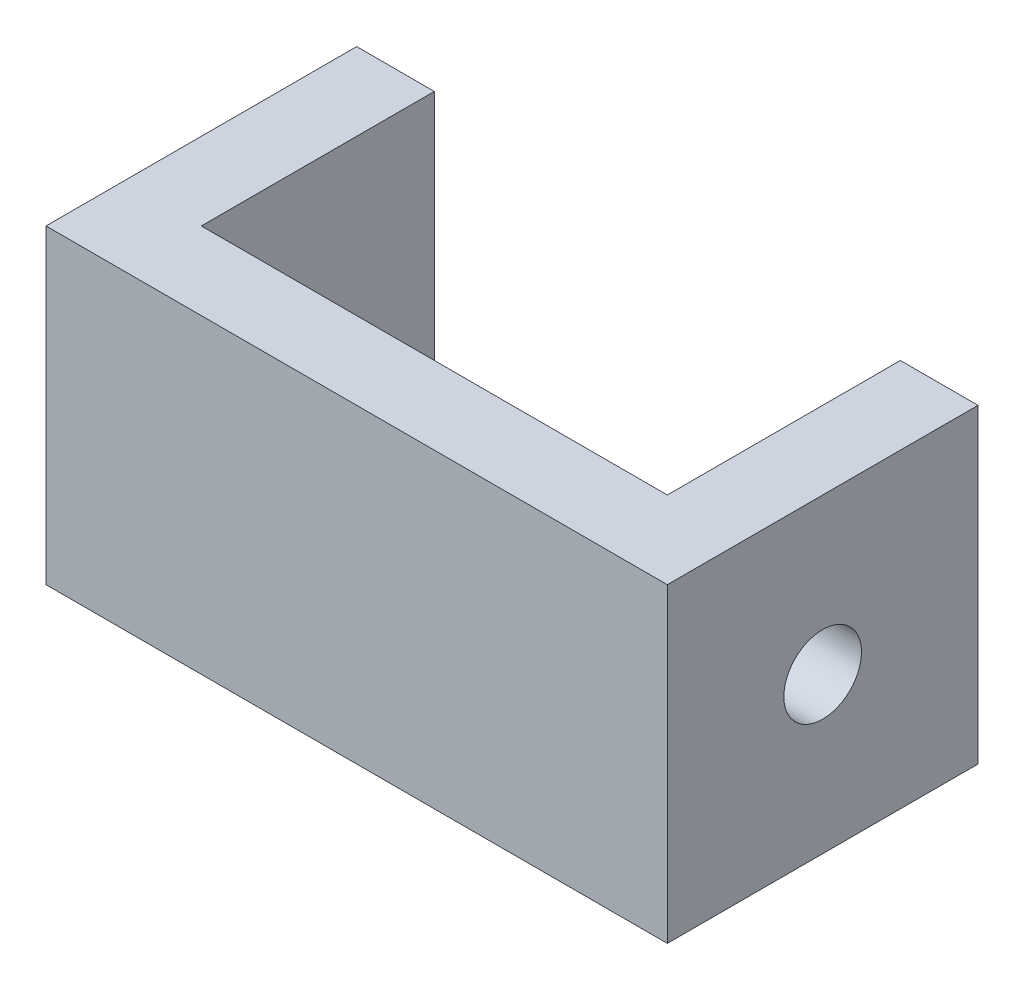
ISO-10303-21;
HEADER;
FILE_DESCRIPTION(('STEP AP214'),'2;1');
FILE_NAME('part.step','',(''),(''),'','','');
FILE_SCHEMA(('AUTOMOTIVE_DESIGN { 1 0 10303 214 1 1 1 1 }'));
ENDSEC;
DATA;
#1=APPLICATION_CONTEXT('core data for automotive mechanical design processes');
#2=APPLICATION_PROTOCOL_DEFINITION('international standard','automotive_design',2000,#1);
#3=PRODUCT_CONTEXT('',#1,'mechanical');
#4=PRODUCT('Part','Part','',(#3));
#5=PRODUCT_RELATED_PRODUCT_CATEGORY('part','',(#4));
#6=PRODUCT_DEFINITION_FORMATION('','',#4);
#7=PRODUCT_DEFINITION_CONTEXT('part definition',#1,'design');
#8=PRODUCT_DEFINITION('design','',#6,#7);
#9=PRODUCT_DEFINITION_SHAPE('','',#8);
#10=(LENGTH_UNIT() NAMED_UNIT(*) SI_UNIT(.MILLI.,.METRE.));
#11=(NAMED_UNIT(*) PLANE_ANGLE_UNIT() SI_UNIT($,.RADIAN.));
#12=(NAMED_UNIT(*) SI_UNIT($,.STERADIAN.) SOLID_ANGLE_UNIT());
#13=UNCERTAINTY_MEASURE_WITH_UNIT(LENGTH_MEASURE(1.E-05),#10,'distance_accuracy_value','');
#14=(GEOMETRIC_REPRESENTATION_CONTEXT(3) GLOBAL_UNCERTAINTY_ASSIGNED_CONTEXT((#13)) GLOBAL_UNIT_ASSIGNED_CONTEXT((#10,
#11,#12)) REPRESENTATION_CONTEXT('',''));
#15=CARTESIAN_POINT('',(0.,0.,0.));
#16=DIRECTION('',(0.,0.,1.));
#17=DIRECTION('',(1.,0.,0.));
#18=AXIS2_PLACEMENT_3D('',#15,#16,#17);
#19=CARTESIAN_POINT('',(24.,10.,0.));
#20=DIRECTION('',(-1.,0.,0.));
#21=DIRECTION('',(0.,0.,1.));
#22=AXIS2_PLACEMENT_3D('',#19,#20,#21);
#23=CYLINDRICAL_SURFACE('',#22,2.5);
#24=CARTESIAN_POINT('',(15.,10.,0.));
#25=DIRECTION('',(-1.,0.,0.));
#26=DIRECTION('',(0.,0.,1.));
#27=AXIS2_PLACEMENT_3D('',#24,#25,#26);
#28=CIRCLE('',#27,2.5);
#29=CARTESIAN_POINT('',(15.,10.,2.5));
#30=VERTEX_POINT('',#29);
#31=EDGE_CURVE('E39',#30,#30,#28,.T.);
#32=CARTESIAN_POINT('',(20.,10.,0.));
#33=DIRECTION('',(-1.,0.,0.));
#34=DIRECTION('',(0.,0.,1.));
#35=AXIS2_PLACEMENT_3D('',#32,#33,#34);
#36=CIRCLE('',#35,2.5);
#37=CARTESIAN_POINT('',(20.,10.,2.5));
#38=VERTEX_POINT('',#37);
#39=EDGE_CURVE('E148',#38,#38,#36,.T.);
#40=CARTESIAN_POINT('',(15.,10.,2.5));
#41=CARTESIAN_POINT('',(15.0520833333333,10.,2.5));
#42=CARTESIAN_POINT('',(15.1041666666667,10.,2.5));
#43=CARTESIAN_POINT('',(15.2083333333333,10.,2.5));
#44=CARTESIAN_POINT('',(15.2604166666667,10.,2.5));
#45=CARTESIAN_POINT('',(15.3645833333333,10.,2.5));
#46=CARTESIAN_POINT('',(15.4166666666667,10.,2.5));
#47=CARTESIAN_POINT('',(15.5208333333333,10.,2.5));
#48=CARTESIAN_POINT('',(15.5729166666667,10.,2.5));
#49=CARTESIAN_POINT('',(15.6770833333333,10.,2.5));
#50=CARTESIAN_POINT('',(15.7291666666667,10.,2.5));
#51=CARTESIAN_POINT('',(15.8333333333333,10.,2.5));
#52=CARTESIAN_POINT('',(15.8854166666667,10.,2.5));
#53=CARTESIAN_POINT('',(15.9895833333333,10.,2.5));
#54=CARTESIAN_POINT('',(16.0416666666667,10.,2.5));
#55=CARTESIAN_POINT('',(16.1458333333333,10.,2.5));
#56=CARTESIAN_POINT('',(16.1979166666667,10.,2.5));
#57=CARTESIAN_POINT('',(16.3020833333333,10.,2.5));
#58=CARTESIAN_POINT('',(16.3541666666667,10.,2.5));
#59=CARTESIAN_POINT('',(16.4583333333333,10.,2.5));
#60=CARTESIAN_POINT('',(16.5104166666667,10.,2.5));
#61=CARTESIAN_POINT('',(16.6145833333333,10.,2.5));
#62=CARTESIAN_POINT('',(16.6666666666667,10.,2.5));
#63=CARTESIAN_POINT('',(16.7708333333333,10.,2.5));
#64=CARTESIAN_POINT('',(16.8229166666667,10.,2.5));
#65=CARTESIAN_POINT('',(16.9270833333333,10.,2.5));
#66=CARTESIAN_POINT('',(16.9791666666667,10.,2.5));
#67=CARTESIAN_POINT('',(17.0833333333333,10.,2.5));
#68=CARTESIAN_POINT('',(17.1354166666667,10.,2.5));
#69=CARTESIAN_POINT('',(17.2395833333333,10.,2.5));
#70=CARTESIAN_POINT('',(17.2916666666667,10.,2.5));
#71=CARTESIAN_POINT('',(17.3958333333333,10.,2.5));
#72=CARTESIAN_POINT('',(17.4479166666667,10.,2.5));
#73=CARTESIAN_POINT('',(17.5520833333333,10.,2.5));
#74=CARTESIAN_POINT('',(17.6041666666667,10.,2.5));
#75=CARTESIAN_POINT('',(17.7083333333333,10.,2.5));
#76=CARTESIAN_POINT('',(17.7604166666667,10.,2.5));
#77=CARTESIAN_POINT('',(17.8645833333333,10.,2.5));
#78=CARTESIAN_POINT('',(17.9166666666667,10.,2.5));
#79=CARTESIAN_POINT('',(18.0208333333333,10.,2.5));
#80=CARTESIAN_POINT('',(18.0729166666667,10.,2.5));
#81=CARTESIAN_POINT('',(18.1770833333333,10.,2.5));
#82=CARTESIAN_POINT('',(18.2291666666667,10.,2.5));
#83=CARTESIAN_POINT('',(18.3333333333333,10.,2.5));
#84=CARTESIAN_POINT('',(18.3854166666667,10.,2.5));
#85=CARTESIAN_POINT('',(18.4895833333333,10.,2.5));
#86=CARTESIAN_POINT('',(18.5416666666667,10.,2.5));
#87=CARTESIAN_POINT('',(18.6458333333333,10.,2.5));
#88=CARTESIAN_POINT('',(18.6979166666667,10.,2.5));
#89=CARTESIAN_POINT('',(18.8020833333333,10.,2.5));
#90=CARTESIAN_POINT('',(18.8541666666667,10.,2.5));
#91=CARTESIAN_POINT('',(18.9583333333333,10.,2.5));
#92=CARTESIAN_POINT('',(19.0104166666667,10.,2.5));
#93=CARTESIAN_POINT('',(19.1145833333333,10.,2.5));
#94=CARTESIAN_POINT('',(19.1666666666667,10.,2.5));
#95=CARTESIAN_POINT('',(19.2708333333333,10.,2.5));
#96=CARTESIAN_POINT('',(19.3229166666667,10.,2.5));
#97=CARTESIAN_POINT('',(19.4270833333333,10.,2.5));
#98=CARTESIAN_POINT('',(19.4791666666667,10.,2.5));
#99=CARTESIAN_POINT('',(19.5833333333333,10.,2.5));
#100=CARTESIAN_POINT('',(19.6354166666667,10.,2.5));
#101=CARTESIAN_POINT('',(19.7395833333333,10.,2.5));
#102=CARTESIAN_POINT('',(19.7916666666667,10.,2.5));
#103=CARTESIAN_POINT('',(19.8958333333333,10.,2.5));
#104=CARTESIAN_POINT('',(19.9479166666667,10.,2.5));
#105=CARTESIAN_POINT('',(20.,10.,2.5));
#106=B_SPLINE_CURVE_WITH_KNOTS('',3,(#40,#41,#42,#43,#44,#45,#46,#47,#48,#49,#50,#51,#52,#53,
#54,#55,#56,#57,#58,#59,#60,#61,#62,#63,#64,#65,#66,#67,#68,#69,#70,#71,#72,#73,#74,#75,#76,#77,
#78,#79,#80,#81,#82,#83,#84,#85,#86,#87,#88,#89,#90,#91,#92,#93,#94,#95,#96,#97,#98,#99,#100,
#101,#102,#103,#104,#105),.UNSPECIFIED.,.F.,.F.,(4,2,2,2,2,2,2,2,2,2,2,2,2,2,2,2,2,2,2,2,2,2,2,
2,2,2,2,2,2,2,2,2,4),(0.,0.15625,0.3125,0.46875,0.625000000000001,0.781250000000001,
0.937500000000001,1.09375,1.25,1.40625,1.5625,1.71875,1.875,2.03125,2.1875,2.34375,2.5,2.65625,
2.8125,2.96875,3.125,3.28125,3.4375,3.59375,3.75,3.90625,4.0625,4.21875,4.375,4.53125,4.6875,
4.84375,5.),.UNSPECIFIED.);
#107=EDGE_CURVE('BSEAM35',#30,#38,#106,.T.);
#108=ORIENTED_EDGE('',*,*,#31,.T.);
#109=ORIENTED_EDGE('',*,*,#39,.F.);
#110=ORIENTED_EDGE('',*,*,#107,.T.);
#111=ORIENTED_EDGE('',*,*,#107,.F.);
#112=EDGE_LOOP('',(#108,#110,#109,#111));
#113=FACE_BOUND('',#112,.T.);
#114=ADVANCED_FACE('F35',(#113),#23,.F.);
#115=CARTESIAN_POINT('',(15.,20.,0.));
#116=DIRECTION('',(-1.,0.,0.));
#117=DIRECTION('',(0.,0.,1.));
#118=AXIS2_PLACEMENT_3D('',#115,#116,#117);
#119=PLANE('',#118);
#120=ORIENTED_EDGE('',*,*,#31,.F.);
#121=EDGE_LOOP('',(#120));
#122=FACE_BOUND('',#121,.T.);
#123=DIRECTION('',(0.,0.,-1.));
#124=VECTOR('',#123,1.);
#125=CARTESIAN_POINT('',(15.,0.,0.));
#126=LINE('',#125,#124);
#127=CARTESIAN_POINT('',(15.,0.,5.00000000000001));
#128=VERTEX_POINT('',#127);
#129=CARTESIAN_POINT('',(15.,0.,-9.99999999999999));
#130=VERTEX_POINT('',#129);
#131=EDGE_CURVE('E141',#128,#130,#126,.T.);
#132=ORIENTED_EDGE('',*,*,#131,.F.);
#133=DIRECTION('',(0.,-1.,0.));
#134=VECTOR('',#133,1.);
#135=CARTESIAN_POINT('',(15.,20.,5.00000000000001));
#136=LINE('',#135,#134);
#137=CARTESIAN_POINT('',(15.,20.,5.00000000000001));
#138=VERTEX_POINT('',#137);
#139=EDGE_CURVE('E53',#138,#128,#136,.T.);
#140=ORIENTED_EDGE('',*,*,#139,.F.);
#141=DIRECTION('',(0.,0.,-1.));
#142=VECTOR('',#141,1.);
#143=CARTESIAN_POINT('',(15.,20.,0.));
#144=LINE('',#143,#142);
#145=CARTESIAN_POINT('',(15.,20.,-9.99999999999999));
#146=VERTEX_POINT('',#145);
#147=EDGE_CURVE('E127',#138,#146,#144,.T.);
#148=ORIENTED_EDGE('',*,*,#147,.T.);
#149=DIRECTION('',(0.,-1.,0.));
#150=VECTOR('',#149,1.);
#151=CARTESIAN_POINT('',(15.,20.,-9.99999999999999));
#152=LINE('',#151,#150);
#153=EDGE_CURVE('E78',#146,#130,#152,.T.);
#154=ORIENTED_EDGE('',*,*,#153,.T.);
#155=EDGE_LOOP('',(#132,#140,#148,#154));
#156=FACE_BOUND('',#155,.T.);
#157=ADVANCED_FACE('F160',(#122,#156),#119,.T.);
#158=CARTESIAN_POINT('',(0.,20.,-9.99999999999999));
#159=DIRECTION('',(0.,0.,-1.));
#160=DIRECTION('',(-1.,0.,0.));
#161=AXIS2_PLACEMENT_3D('',#158,#159,#160);
#162=PLANE('',#161);
#163=DIRECTION('',(1.,0.,0.));
#164=VECTOR('',#163,1.);
#165=CARTESIAN_POINT('',(0.,0.,-9.99999999999999));
#166=LINE('',#165,#164);
#167=CARTESIAN_POINT('',(20.,0.,-9.99999999999999));
#168=VERTEX_POINT('',#167);
#169=EDGE_CURVE('E165',#130,#168,#166,.T.);
#170=ORIENTED_EDGE('',*,*,#169,.F.);
#171=ORIENTED_EDGE('',*,*,#153,.F.);
#172=DIRECTION('',(1.,0.,0.));
#173=VECTOR('',#172,1.);
#174=CARTESIAN_POINT('',(0.,20.,-9.99999999999999));
#175=LINE('',#174,#173);
#176=CARTESIAN_POINT('',(20.,20.,-9.99999999999999));
#177=VERTEX_POINT('',#176);
#178=EDGE_CURVE('E109',#146,#177,#175,.T.);
#179=ORIENTED_EDGE('',*,*,#178,.T.);
#180=DIRECTION('',(0.,-1.,0.));
#181=VECTOR('',#180,1.);
#182=CARTESIAN_POINT('',(20.,20.,-9.99999999999999));
#183=LINE('',#182,#181);
#184=EDGE_CURVE('E118',#177,#168,#183,.T.);
#185=ORIENTED_EDGE('',*,*,#184,.T.);
#186=EDGE_LOOP('',(#170,#171,#179,#185));
#187=FACE_BOUND('',#186,.T.);
#188=ADVANCED_FACE('F126',(#187),#162,.T.);
#189=CARTESIAN_POINT('',(20.,20.,0.));
#190=DIRECTION('',(-1.,0.,0.));
#191=DIRECTION('',(0.,0.,1.));
#192=AXIS2_PLACEMENT_3D('',#189,#190,#191);
#193=PLANE('',#192);
#194=ORIENTED_EDGE('',*,*,#39,.T.);
#195=EDGE_LOOP('',(#194));
#196=FACE_BOUND('',#195,.T.);
#197=DIRECTION('',(0.,0.,-1.));
#198=VECTOR('',#197,1.);
#199=CARTESIAN_POINT('',(20.,0.,0.));
#200=LINE('',#199,#198);
#201=CARTESIAN_POINT('',(20.,0.,10.));
#202=VERTEX_POINT('',#201);
#203=EDGE_CURVE('E121',#202,#168,#200,.T.);
#204=ORIENTED_EDGE('',*,*,#203,.T.);
#205=ORIENTED_EDGE('',*,*,#184,.F.);
#206=DIRECTION('',(0.,0.,-1.));
#207=VECTOR('',#206,1.);
#208=CARTESIAN_POINT('',(20.,20.,0.));
#209=LINE('',#208,#207);
#210=CARTESIAN_POINT('',(20.,20.,10.));
#211=VERTEX_POINT('',#210);
#212=EDGE_CURVE('E103',#211,#177,#209,.T.);
#213=ORIENTED_EDGE('',*,*,#212,.F.);
#214=DIRECTION('',(0.,-1.,0.));
#215=VECTOR('',#214,1.);
#216=CARTESIAN_POINT('',(20.,20.,10.));
#217=LINE('',#216,#215);
#218=EDGE_CURVE('E124',#211,#202,#217,.T.);
#219=ORIENTED_EDGE('',*,*,#218,.T.);
#220=EDGE_LOOP('',(#204,#205,#213,#219));
#221=FACE_BOUND('',#220,.T.);
#222=ADVANCED_FACE('F119',(#196,#221),#193,.F.);
#223=CARTESIAN_POINT('',(-15.,20.,0.));
#224=DIRECTION('',(-1.,0.,0.));
#225=DIRECTION('',(0.,0.,1.));
#226=AXIS2_PLACEMENT_3D('',#223,#224,#225);
#227=PLANE('',#226);
#228=CARTESIAN_POINT('',(-15.,10.,0.));
#229=DIRECTION('',(-1.,0.,0.));
#230=DIRECTION('',(0.,0.,1.));
#231=AXIS2_PLACEMENT_3D('',#228,#229,#230);
#232=CIRCLE('',#231,2.5);
#233=CARTESIAN_POINT('',(-15.,10.,2.5));
#234=VERTEX_POINT('',#233);
#235=EDGE_CURVE('E144',#234,#234,#232,.T.);
#236=ORIENTED_EDGE('',*,*,#235,.T.);
#237=EDGE_LOOP('',(#236));
#238=FACE_BOUND('',#237,.T.);
#239=DIRECTION('',(0.,0.,-1.));
#240=VECTOR('',#239,1.);
#241=CARTESIAN_POINT('',(-15.,0.,0.));
#242=LINE('',#241,#240);
#243=CARTESIAN_POINT('',(-15.,0.,5.00000000000001));
#244=VERTEX_POINT('',#243);
#245=CARTESIAN_POINT('',(-15.,0.,-9.99999999999999));
#246=VERTEX_POINT('',#245);
#247=EDGE_CURVE('E186',#244,#246,#242,.T.);
#248=ORIENTED_EDGE('',*,*,#247,.T.);
#249=DIRECTION('',(0.,-1.,0.));
#250=VECTOR('',#249,1.);
#251=CARTESIAN_POINT('',(-15.,20.,-9.99999999999999));
#252=LINE('',#251,#250);
#253=CARTESIAN_POINT('',(-15.,20.,-9.99999999999999));
#254=VERTEX_POINT('',#253);
#255=EDGE_CURVE('E45',#254,#246,#252,.T.);
#256=ORIENTED_EDGE('',*,*,#255,.F.);
#257=DIRECTION('',(0.,0.,-1.));
#258=VECTOR('',#257,1.);
#259=CARTESIAN_POINT('',(-15.,20.,0.));
#260=LINE('',#259,#258);
#261=CARTESIAN_POINT('',(-15.,20.,5.00000000000001));
#262=VERTEX_POINT('',#261);
#263=EDGE_CURVE('E135',#262,#254,#260,.T.);
#264=ORIENTED_EDGE('',*,*,#263,.F.);
#265=DIRECTION('',(0.,-1.,0.));
#266=VECTOR('',#265,1.);
#267=CARTESIAN_POINT('',(-15.,20.,5.00000000000001));
#268=LINE('',#267,#266);
#269=EDGE_CURVE('E11',#262,#244,#268,.T.);
#270=ORIENTED_EDGE('',*,*,#269,.T.);
#271=EDGE_LOOP('',(#248,#256,#264,#270));
#272=FACE_BOUND('',#271,.T.);
#273=ADVANCED_FACE('F187',(#238,#272),#227,.F.);
#274=CARTESIAN_POINT('',(0.,20.,5.00000000000001));
#275=DIRECTION('',(0.,0.,-1.));
#276=DIRECTION('',(-1.,0.,0.));
#277=AXIS2_PLACEMENT_3D('',#274,#275,#276);
#278=PLANE('',#277);
#279=DIRECTION('',(1.,0.,0.));
#280=VECTOR('',#279,1.);
#281=CARTESIAN_POINT('',(0.,0.,5.00000000000001));
#282=LINE('',#281,#280);
#283=EDGE_CURVE('E147',#244,#128,#282,.T.);
#284=ORIENTED_EDGE('',*,*,#283,.F.);
#285=ORIENTED_EDGE('',*,*,#269,.F.);
#286=DIRECTION('',(1.,0.,0.));
#287=VECTOR('',#286,1.);
#288=CARTESIAN_POINT('',(0.,20.,5.00000000000001));
#289=LINE('',#288,#287);
#290=EDGE_CURVE('E139',#262,#138,#289,.T.);
#291=ORIENTED_EDGE('',*,*,#290,.T.);
#292=ORIENTED_EDGE('',*,*,#139,.T.);
#293=EDGE_LOOP('',(#284,#285,#291,#292));
#294=FACE_BOUND('',#293,.T.);
#295=ADVANCED_FACE('F37',(#294),#278,.T.);
#296=CARTESIAN_POINT('',(-20.,0.,-9.99999999999999));
#297=VERTEX_POINT('',#296);
#298=EDGE_CURVE('E168',#297,#246,#166,.T.);
#299=ORIENTED_EDGE('',*,*,#298,.F.);
#300=DIRECTION('',(0.,-1.,0.));
#301=VECTOR('',#300,1.);
#302=CARTESIAN_POINT('',(-20.,20.,-9.99999999999999));
#303=LINE('',#302,#301);
#304=CARTESIAN_POINT('',(-20.,20.,-9.99999999999999));
#305=VERTEX_POINT('',#304);
#306=EDGE_CURVE('E177',#305,#297,#303,.T.);
#307=ORIENTED_EDGE('',*,*,#306,.F.);
#308=EDGE_CURVE('E129',#305,#254,#175,.T.);
#309=ORIENTED_EDGE('',*,*,#308,.T.);
#310=ORIENTED_EDGE('',*,*,#255,.T.);
#311=EDGE_LOOP('',(#299,#307,#309,#310));
#312=FACE_BOUND('',#311,.T.);
#313=ADVANCED_FACE('F181',(#312),#162,.T.);
#314=CARTESIAN_POINT('',(0.,20.,0.));
#315=DIRECTION('',(0.,1.,0.));
#316=DIRECTION('',(0.,0.,1.));
#317=AXIS2_PLACEMENT_3D('',#314,#315,#316);
#318=PLANE('',#317);
#319=ORIENTED_EDGE('',*,*,#290,.F.);
#320=ORIENTED_EDGE('',*,*,#263,.T.);
#321=ORIENTED_EDGE('',*,*,#308,.F.);
#322=DIRECTION('',(0.,0.,-1.));
#323=VECTOR('',#322,1.);
#324=CARTESIAN_POINT('',(-20.,20.,0.));
#325=LINE('',#324,#323);
#326=CARTESIAN_POINT('',(-20.,20.,10.));
#327=VERTEX_POINT('',#326);
#328=EDGE_CURVE('E134',#327,#305,#325,.T.);
#329=ORIENTED_EDGE('',*,*,#328,.F.);
#330=DIRECTION('',(1.,0.,0.));
#331=VECTOR('',#330,1.);
#332=CARTESIAN_POINT('',(0.,20.,10.));
#333=LINE('',#332,#331);
#334=EDGE_CURVE('E112',#327,#211,#333,.T.);
#335=ORIENTED_EDGE('',*,*,#334,.T.);
#336=ORIENTED_EDGE('',*,*,#212,.T.);
#337=ORIENTED_EDGE('',*,*,#178,.F.);
#338=ORIENTED_EDGE('',*,*,#147,.F.);
#339=EDGE_LOOP('',(#319,#320,#321,#329,#335,#336,#337,#338));
#340=FACE_BOUND('',#339,.T.);
#341=ADVANCED_FACE('F106',(#340),#318,.T.);
#342=CARTESIAN_POINT('',(0.,0.,0.));
#343=DIRECTION('',(0.,1.,0.));
#344=DIRECTION('',(0.,0.,1.));
#345=AXIS2_PLACEMENT_3D('',#342,#343,#344);
#346=PLANE('',#345);
#347=ORIENTED_EDGE('',*,*,#283,.T.);
#348=ORIENTED_EDGE('',*,*,#131,.T.);
#349=ORIENTED_EDGE('',*,*,#169,.T.);
#350=ORIENTED_EDGE('',*,*,#203,.F.);
#351=DIRECTION('',(1.,0.,0.));
#352=VECTOR('',#351,1.);
#353=CARTESIAN_POINT('',(0.,0.,10.));
#354=LINE('',#353,#352);
#355=CARTESIAN_POINT('',(-20.,0.,10.));
#356=VERTEX_POINT('',#355);
#357=EDGE_CURVE('E193',#356,#202,#354,.T.);
#358=ORIENTED_EDGE('',*,*,#357,.F.);
#359=DIRECTION('',(0.,0.,-1.));
#360=VECTOR('',#359,1.);
#361=CARTESIAN_POINT('',(-20.,0.,0.));
#362=LINE('',#361,#360);
#363=EDGE_CURVE('E192',#356,#297,#362,.T.);
#364=ORIENTED_EDGE('',*,*,#363,.T.);
#365=ORIENTED_EDGE('',*,*,#298,.T.);
#366=ORIENTED_EDGE('',*,*,#247,.F.);
#367=EDGE_LOOP('',(#347,#348,#349,#350,#358,#364,#365,#366));
#368=FACE_BOUND('',#367,.T.);
#369=ADVANCED_FACE('F189',(#368),#346,.F.);
#370=CARTESIAN_POINT('',(-20.,10.,0.));
#371=DIRECTION('',(-1.,0.,0.));
#372=DIRECTION('',(0.,0.,1.));
#373=AXIS2_PLACEMENT_3D('',#370,#371,#372);
#374=CIRCLE('',#373,2.5);
#375=CARTESIAN_POINT('',(-20.,10.,2.5));
#376=VERTEX_POINT('',#375);
#377=EDGE_CURVE('E151',#376,#376,#374,.T.);
#378=ORIENTED_EDGE('',*,*,#377,.T.);
#379=EDGE_LOOP('',(#378));
#380=FACE_BOUND('',#379,.T.);
#381=ORIENTED_EDGE('',*,*,#235,.F.);
#382=EDGE_LOOP('',(#381));
#383=FACE_BOUND('',#382,.T.);
#384=ADVANCED_FACE('F213',(#380,#383),#23,.F.);
#385=CARTESIAN_POINT('',(-20.,20.,0.));
#386=DIRECTION('',(-1.,0.,0.));
#387=DIRECTION('',(0.,0.,1.));
#388=AXIS2_PLACEMENT_3D('',#385,#386,#387);
#389=PLANE('',#388);
#390=ORIENTED_EDGE('',*,*,#377,.F.);
#391=EDGE_LOOP('',(#390));
#392=FACE_BOUND('',#391,.T.);
#393=ORIENTED_EDGE('',*,*,#363,.F.);
#394=DIRECTION('',(0.,-1.,0.));
#395=VECTOR('',#394,1.);
#396=CARTESIAN_POINT('',(-20.,20.,10.));
#397=LINE('',#396,#395);
#398=EDGE_CURVE('E175',#327,#356,#397,.T.);
#399=ORIENTED_EDGE('',*,*,#398,.F.);
#400=ORIENTED_EDGE('',*,*,#328,.T.);
#401=ORIENTED_EDGE('',*,*,#306,.T.);
#402=EDGE_LOOP('',(#393,#399,#400,#401));
#403=FACE_BOUND('',#402,.T.);
#404=ADVANCED_FACE('F199',(#392,#403),#389,.T.);
#405=CARTESIAN_POINT('',(0.,20.,10.));
#406=DIRECTION('',(0.,0.,-1.));
#407=DIRECTION('',(-1.,0.,0.));
#408=AXIS2_PLACEMENT_3D('',#405,#406,#407);
#409=PLANE('',#408);
#410=ORIENTED_EDGE('',*,*,#218,.F.);
#411=ORIENTED_EDGE('',*,*,#334,.F.);
#412=ORIENTED_EDGE('',*,*,#398,.T.);
#413=ORIENTED_EDGE('',*,*,#357,.T.);
#414=EDGE_LOOP('',(#410,#411,#412,#413));
#415=FACE_BOUND('',#414,.T.);
#416=ADVANCED_FACE('F197',(#415),#409,.F.);
#417=CLOSED_SHELL('',(#114,#157,#188,#222,#273,#295,#313,#341,#369,#384,#404,#416));
#418=MANIFOLD_SOLID_BREP('B2',#417);
#419=ADVANCED_BREP_SHAPE_REPRESENTATION('',(#18,#418),#14);
#420=SHAPE_DEFINITION_REPRESENTATION(#9,#419);
ENDSEC;
END-ISO-10303-21;
